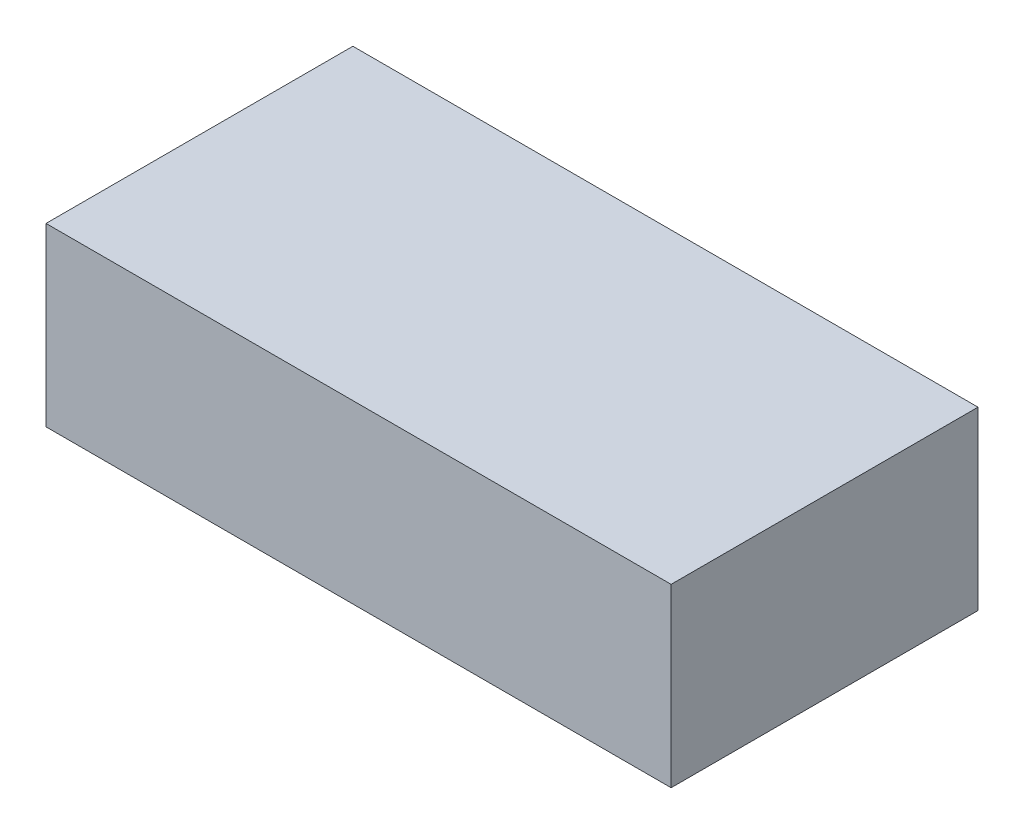
ISO-10303-21;
HEADER;
FILE_DESCRIPTION(('STEP AP214'),'2;1');
FILE_NAME('part.step','',(''),(''),'','','');
FILE_SCHEMA(('AUTOMOTIVE_DESIGN { 1 0 10303 214 1 1 1 1 }'));
ENDSEC;
DATA;
#1=APPLICATION_CONTEXT('core data for automotive mechanical design processes');
#2=APPLICATION_PROTOCOL_DEFINITION('international standard','automotive_design',2000,#1);
#3=PRODUCT_CONTEXT('',#1,'mechanical');
#4=PRODUCT('Part','Part','',(#3));
#5=PRODUCT_RELATED_PRODUCT_CATEGORY('part','',(#4));
#6=PRODUCT_DEFINITION_FORMATION('','',#4);
#7=PRODUCT_DEFINITION_CONTEXT('part definition',#1,'design');
#8=PRODUCT_DEFINITION('design','',#6,#7);
#9=PRODUCT_DEFINITION_SHAPE('','',#8);
#10=(LENGTH_UNIT() NAMED_UNIT(*) SI_UNIT(.MILLI.,.METRE.));
#11=(NAMED_UNIT(*) PLANE_ANGLE_UNIT() SI_UNIT($,.RADIAN.));
#12=(NAMED_UNIT(*) SI_UNIT($,.STERADIAN.) SOLID_ANGLE_UNIT());
#13=UNCERTAINTY_MEASURE_WITH_UNIT(LENGTH_MEASURE(1.E-05),#10,'distance_accuracy_value','');
#14=(GEOMETRIC_REPRESENTATION_CONTEXT(3) GLOBAL_UNCERTAINTY_ASSIGNED_CONTEXT((#13)) GLOBAL_UNIT_ASSIGNED_CONTEXT((#10,
#11,#12)) REPRESENTATION_CONTEXT('',''));
#15=CARTESIAN_POINT('',(0.,0.,0.));
#16=DIRECTION('',(0.,0.,1.));
#17=DIRECTION('',(1.,0.,0.));
#18=AXIS2_PLACEMENT_3D('',#15,#16,#17);
#19=CARTESIAN_POINT('',(-110.,62.,54.));
#20=DIRECTION('',(1.,0.,0.));
#21=DIRECTION('',(0.,0.,-1.));
#22=AXIS2_PLACEMENT_3D('',#19,#20,#21);
#23=PLANE('',#22);
#24=DIRECTION('',(0.,1.,0.));
#25=VECTOR('',#24,1.);
#26=CARTESIAN_POINT('',(-110.,37.,-24.3));
#27=LINE('',#26,#25);
#28=CARTESIAN_POINT('',(-110.,37.,-24.3));
#29=VERTEX_POINT('',#28);
#30=CARTESIAN_POINT('',(-110.,57.,-24.3));
#31=VERTEX_POINT('',#30);
#32=EDGE_CURVE('E143',#29,#31,#27,.T.);
#33=ORIENTED_EDGE('',*,*,#32,.F.);
#34=DIRECTION('',(0.,0.,1.));
#35=VECTOR('',#34,1.);
#36=CARTESIAN_POINT('',(-110.,37.,-49.));
#37=LINE('',#36,#35);
#38=CARTESIAN_POINT('',(-110.,37.,-49.));
#39=VERTEX_POINT('',#38);
#40=EDGE_CURVE('E156',#39,#29,#37,.T.);
#41=ORIENTED_EDGE('',*,*,#40,.F.);
#42=DIRECTION('',(0.,-1.,0.));
#43=VECTOR('',#42,1.);
#44=CARTESIAN_POINT('',(-110.,37.,-49.));
#45=LINE('',#44,#43);
#46=CARTESIAN_POINT('',(-110.,57.,-49.));
#47=VERTEX_POINT('',#46);
#48=EDGE_CURVE('E165',#47,#39,#45,.T.);
#49=ORIENTED_EDGE('',*,*,#48,.F.);
#50=DIRECTION('',(0.,0.,-1.));
#51=VECTOR('',#50,1.);
#52=CARTESIAN_POINT('',(-110.,57.,-49.));
#53=LINE('',#52,#51);
#54=EDGE_CURVE('E146',#31,#47,#53,.T.);
#55=ORIENTED_EDGE('',*,*,#54,.F.);
#56=EDGE_LOOP('',(#33,#41,#49,#55));
#57=FACE_BOUND('',#56,.T.);
#58=DIRECTION('',(0.,0.,1.));
#59=VECTOR('',#58,1.);
#60=CARTESIAN_POINT('',(-110.,0.,54.));
#61=LINE('',#60,#59);
#62=CARTESIAN_POINT('',(-110.,0.,-54.));
#63=VERTEX_POINT('',#62);
#64=CARTESIAN_POINT('',(-110.,0.,54.));
#65=VERTEX_POINT('',#64);
#66=EDGE_CURVE('E197',#63,#65,#61,.T.);
#67=ORIENTED_EDGE('',*,*,#66,.T.);
#68=DIRECTION('',(0.,-1.,0.));
#69=VECTOR('',#68,1.);
#70=CARTESIAN_POINT('',(-110.,62.,54.));
#71=LINE('',#70,#69);
#72=CARTESIAN_POINT('',(-110.,62.,54.));
#73=VERTEX_POINT('',#72);
#74=EDGE_CURVE('E202',#73,#65,#71,.T.);
#75=ORIENTED_EDGE('',*,*,#74,.F.);
#76=DIRECTION('',(0.,0.,1.));
#77=VECTOR('',#76,1.);
#78=CARTESIAN_POINT('',(-110.,62.,54.));
#79=LINE('',#78,#77);
#80=CARTESIAN_POINT('',(-110.,62.,-54.));
#81=VERTEX_POINT('',#80);
#82=EDGE_CURVE('E188',#81,#73,#79,.T.);
#83=ORIENTED_EDGE('',*,*,#82,.F.);
#84=DIRECTION('',(0.,-1.,0.));
#85=VECTOR('',#84,1.);
#86=CARTESIAN_POINT('',(-110.,62.,-54.));
#87=LINE('',#86,#85);
#88=EDGE_CURVE('E41',#81,#63,#87,.T.);
#89=ORIENTED_EDGE('',*,*,#88,.T.);
#90=EDGE_LOOP('',(#67,#75,#83,#89));
#91=FACE_BOUND('',#90,.T.);
#92=DIRECTION('',(0.,1.,0.));
#93=VECTOR('',#92,1.);
#94=CARTESIAN_POINT('',(-110.,6.,47.));
#95=LINE('',#94,#93);
#96=CARTESIAN_POINT('',(-110.,6.,47.));
#97=VERTEX_POINT('',#96);
#98=CARTESIAN_POINT('',(-110.,56.,47.));
#99=VERTEX_POINT('',#98);
#100=EDGE_CURVE('E142',#97,#99,#95,.T.);
#101=ORIENTED_EDGE('',*,*,#100,.F.);
#102=DIRECTION('',(0.,0.,1.));
#103=VECTOR('',#102,1.);
#104=CARTESIAN_POINT('',(-110.,6.,-3.00000000000002));
#105=LINE('',#104,#103);
#106=CARTESIAN_POINT('',(-110.,6.,-3.00000000000002));
#107=VERTEX_POINT('',#106);
#108=EDGE_CURVE('E139',#107,#97,#105,.T.);
#109=ORIENTED_EDGE('',*,*,#108,.F.);
#110=DIRECTION('',(0.,-1.,0.));
#111=VECTOR('',#110,1.);
#112=CARTESIAN_POINT('',(-110.,6.,-3.00000000000002));
#113=LINE('',#112,#111);
#114=CARTESIAN_POINT('',(-110.,56.,-3.00000000000002));
#115=VERTEX_POINT('',#114);
#116=EDGE_CURVE('E53',#115,#107,#113,.T.);
#117=ORIENTED_EDGE('',*,*,#116,.F.);
#118=DIRECTION('',(0.,0.,-1.));
#119=VECTOR('',#118,1.);
#120=CARTESIAN_POINT('',(-110.,56.,-3.00000000000002));
#121=LINE('',#120,#119);
#122=EDGE_CURVE('E48',#99,#115,#121,.T.);
#123=ORIENTED_EDGE('',*,*,#122,.F.);
#124=EDGE_LOOP('',(#101,#109,#117,#123));
#125=FACE_BOUND('',#124,.T.);
#126=ADVANCED_FACE('F33',(#57,#91,#125),#23,.F.);
#127=CARTESIAN_POINT('',(110.,62.,54.));
#128=DIRECTION('',(-1.,0.,0.));
#129=DIRECTION('',(0.,0.,1.));
#130=AXIS2_PLACEMENT_3D('',#127,#128,#129);
#131=PLANE('',#130);
#132=DIRECTION('',(0.,0.,-1.));
#133=VECTOR('',#132,1.);
#134=CARTESIAN_POINT('',(110.,0.,54.));
#135=LINE('',#134,#133);
#136=CARTESIAN_POINT('',(110.,0.,54.));
#137=VERTEX_POINT('',#136);
#138=CARTESIAN_POINT('',(110.,0.,-54.));
#139=VERTEX_POINT('',#138);
#140=EDGE_CURVE('E181',#137,#139,#135,.T.);
#141=ORIENTED_EDGE('',*,*,#140,.T.);
#142=DIRECTION('',(0.,-1.,0.));
#143=VECTOR('',#142,1.);
#144=CARTESIAN_POINT('',(110.,62.,-54.));
#145=LINE('',#144,#143);
#146=CARTESIAN_POINT('',(110.,62.,-54.));
#147=VERTEX_POINT('',#146);
#148=EDGE_CURVE('E11',#147,#139,#145,.T.);
#149=ORIENTED_EDGE('',*,*,#148,.F.);
#150=DIRECTION('',(0.,0.,-1.));
#151=VECTOR('',#150,1.);
#152=CARTESIAN_POINT('',(110.,62.,54.));
#153=LINE('',#152,#151);
#154=CARTESIAN_POINT('',(110.,62.,54.));
#155=VERTEX_POINT('',#154);
#156=EDGE_CURVE('E182',#155,#147,#153,.T.);
#157=ORIENTED_EDGE('',*,*,#156,.F.);
#158=DIRECTION('',(0.,-1.,0.));
#159=VECTOR('',#158,1.);
#160=CARTESIAN_POINT('',(110.,62.,54.));
#161=LINE('',#160,#159);
#162=EDGE_CURVE('E192',#155,#137,#161,.T.);
#163=ORIENTED_EDGE('',*,*,#162,.T.);
#164=EDGE_LOOP('',(#141,#149,#157,#163));
#165=FACE_BOUND('',#164,.T.);
#166=ADVANCED_FACE('F35',(#165),#131,.F.);
#167=CARTESIAN_POINT('',(-110.,62.,-54.));
#168=DIRECTION('',(0.,0.,1.));
#169=DIRECTION('',(1.,0.,0.));
#170=AXIS2_PLACEMENT_3D('',#167,#168,#169);
#171=PLANE('',#170);
#172=DIRECTION('',(-1.,0.,0.));
#173=VECTOR('',#172,1.);
#174=CARTESIAN_POINT('',(-110.,0.,-54.));
#175=LINE('',#174,#173);
#176=EDGE_CURVE('E195',#139,#63,#175,.T.);
#177=ORIENTED_EDGE('',*,*,#176,.T.);
#178=ORIENTED_EDGE('',*,*,#88,.F.);
#179=DIRECTION('',(-1.,0.,0.));
#180=VECTOR('',#179,1.);
#181=CARTESIAN_POINT('',(-110.,62.,-54.));
#182=LINE('',#181,#180);
#183=EDGE_CURVE('E185',#147,#81,#182,.T.);
#184=ORIENTED_EDGE('',*,*,#183,.F.);
#185=ORIENTED_EDGE('',*,*,#148,.T.);
#186=EDGE_LOOP('',(#177,#178,#184,#185));
#187=FACE_BOUND('',#186,.T.);
#188=ADVANCED_FACE('F224',(#187),#171,.F.);
#189=CARTESIAN_POINT('',(-110.,62.,54.));
#190=DIRECTION('',(0.,0.,-1.));
#191=DIRECTION('',(-1.,0.,0.));
#192=AXIS2_PLACEMENT_3D('',#189,#190,#191);
#193=PLANE('',#192);
#194=DIRECTION('',(1.,0.,0.));
#195=VECTOR('',#194,1.);
#196=CARTESIAN_POINT('',(-110.,0.,54.));
#197=LINE('',#196,#195);
#198=EDGE_CURVE('E186',#65,#137,#197,.T.);
#199=ORIENTED_EDGE('',*,*,#198,.T.);
#200=ORIENTED_EDGE('',*,*,#162,.F.);
#201=DIRECTION('',(1.,0.,0.));
#202=VECTOR('',#201,1.);
#203=CARTESIAN_POINT('',(-110.,62.,54.));
#204=LINE('',#203,#202);
#205=EDGE_CURVE('E190',#73,#155,#204,.T.);
#206=ORIENTED_EDGE('',*,*,#205,.F.);
#207=ORIENTED_EDGE('',*,*,#74,.T.);
#208=EDGE_LOOP('',(#199,#200,#206,#207));
#209=FACE_BOUND('',#208,.T.);
#210=ADVANCED_FACE('F217',(#209),#193,.F.);
#211=CARTESIAN_POINT('',(0.,62.,0.));
#212=DIRECTION('',(0.,-1.,0.));
#213=DIRECTION('',(0.,0.,-1.));
#214=AXIS2_PLACEMENT_3D('',#211,#212,#213);
#215=PLANE('',#214);
#216=ORIENTED_EDGE('',*,*,#156,.T.);
#217=ORIENTED_EDGE('',*,*,#183,.T.);
#218=ORIENTED_EDGE('',*,*,#82,.T.);
#219=ORIENTED_EDGE('',*,*,#205,.T.);
#220=EDGE_LOOP('',(#216,#217,#218,#219));
#221=FACE_BOUND('',#220,.T.);
#222=ADVANCED_FACE('F223',(#221),#215,.F.);
#223=CARTESIAN_POINT('',(0.,0.,0.));
#224=DIRECTION('',(0.,-1.,0.));
#225=DIRECTION('',(0.,0.,-1.));
#226=AXIS2_PLACEMENT_3D('',#223,#224,#225);
#227=PLANE('',#226);
#228=ORIENTED_EDGE('',*,*,#140,.F.);
#229=ORIENTED_EDGE('',*,*,#198,.F.);
#230=ORIENTED_EDGE('',*,*,#66,.F.);
#231=ORIENTED_EDGE('',*,*,#176,.F.);
#232=EDGE_LOOP('',(#228,#229,#230,#231));
#233=FACE_BOUND('',#232,.T.);
#234=ADVANCED_FACE('F214',(#233),#227,.T.);
#235=CARTESIAN_POINT('',(-110.5,37.,-24.3));
#236=DIRECTION('',(0.,0.,-1.));
#237=DIRECTION('',(-1.,0.,0.));
#238=AXIS2_PLACEMENT_3D('',#235,#236,#237);
#239=PLANE('',#238);
#240=ORIENTED_EDGE('',*,*,#32,.T.);
#241=DIRECTION('',(1.,0.,0.));
#242=VECTOR('',#241,1.);
#243=CARTESIAN_POINT('',(-110.5,57.,-24.3));
#244=LINE('',#243,#242);
#245=CARTESIAN_POINT('',(-110.5,57.,-24.3));
#246=VERTEX_POINT('',#245);
#247=EDGE_CURVE('E178',#246,#31,#244,.T.);
#248=ORIENTED_EDGE('',*,*,#247,.F.);
#249=DIRECTION('',(0.,1.,0.));
#250=VECTOR('',#249,1.);
#251=CARTESIAN_POINT('',(-110.5,37.,-24.3));
#252=LINE('',#251,#250);
#253=CARTESIAN_POINT('',(-110.5,37.,-24.3));
#254=VERTEX_POINT('',#253);
#255=EDGE_CURVE('E152',#254,#246,#252,.T.);
#256=ORIENTED_EDGE('',*,*,#255,.F.);
#257=DIRECTION('',(1.,0.,0.));
#258=VECTOR('',#257,1.);
#259=CARTESIAN_POINT('',(-110.5,37.,-24.3));
#260=LINE('',#259,#258);
#261=EDGE_CURVE('E161',#254,#29,#260,.T.);
#262=ORIENTED_EDGE('',*,*,#261,.T.);
#263=EDGE_LOOP('',(#240,#248,#256,#262));
#264=FACE_BOUND('',#263,.T.);
#265=ADVANCED_FACE('F239',(#264),#239,.F.);
#266=CARTESIAN_POINT('',(-110.5,57.,-49.));
#267=DIRECTION('',(0.,-1.,0.));
#268=DIRECTION('',(0.,0.,-1.));
#269=AXIS2_PLACEMENT_3D('',#266,#267,#268);
#270=PLANE('',#269);
#271=ORIENTED_EDGE('',*,*,#54,.T.);
#272=DIRECTION('',(1.,0.,0.));
#273=VECTOR('',#272,1.);
#274=CARTESIAN_POINT('',(-110.5,57.,-49.));
#275=LINE('',#274,#273);
#276=CARTESIAN_POINT('',(-110.5,57.,-49.));
#277=VERTEX_POINT('',#276);
#278=EDGE_CURVE('E175',#277,#47,#275,.T.);
#279=ORIENTED_EDGE('',*,*,#278,.F.);
#280=DIRECTION('',(0.,0.,-1.));
#281=VECTOR('',#280,1.);
#282=CARTESIAN_POINT('',(-110.5,57.,-49.));
#283=LINE('',#282,#281);
#284=EDGE_CURVE('E155',#246,#277,#283,.T.);
#285=ORIENTED_EDGE('',*,*,#284,.F.);
#286=ORIENTED_EDGE('',*,*,#247,.T.);
#287=EDGE_LOOP('',(#271,#279,#285,#286));
#288=FACE_BOUND('',#287,.T.);
#289=ADVANCED_FACE('F244',(#288),#270,.F.);
#290=CARTESIAN_POINT('',(-110.5,37.,-49.));
#291=DIRECTION('',(0.,0.,1.));
#292=DIRECTION('',(1.,0.,0.));
#293=AXIS2_PLACEMENT_3D('',#290,#291,#292);
#294=PLANE('',#293);
#295=ORIENTED_EDGE('',*,*,#48,.T.);
#296=DIRECTION('',(1.,0.,0.));
#297=VECTOR('',#296,1.);
#298=CARTESIAN_POINT('',(-110.5,37.,-49.));
#299=LINE('',#298,#297);
#300=CARTESIAN_POINT('',(-110.5,37.,-49.));
#301=VERTEX_POINT('',#300);
#302=EDGE_CURVE('E172',#301,#39,#299,.T.);
#303=ORIENTED_EDGE('',*,*,#302,.F.);
#304=DIRECTION('',(0.,-1.,0.));
#305=VECTOR('',#304,1.);
#306=CARTESIAN_POINT('',(-110.5,37.,-49.));
#307=LINE('',#306,#305);
#308=EDGE_CURVE('E158',#277,#301,#307,.T.);
#309=ORIENTED_EDGE('',*,*,#308,.F.);
#310=ORIENTED_EDGE('',*,*,#278,.T.);
#311=EDGE_LOOP('',(#295,#303,#309,#310));
#312=FACE_BOUND('',#311,.T.);
#313=ADVANCED_FACE('F248',(#312),#294,.F.);
#314=CARTESIAN_POINT('',(-110.5,37.,-49.));
#315=DIRECTION('',(0.,1.,0.));
#316=DIRECTION('',(0.,0.,1.));
#317=AXIS2_PLACEMENT_3D('',#314,#315,#316);
#318=PLANE('',#317);
#319=ORIENTED_EDGE('',*,*,#40,.T.);
#320=ORIENTED_EDGE('',*,*,#261,.F.);
#321=DIRECTION('',(0.,0.,1.));
#322=VECTOR('',#321,1.);
#323=CARTESIAN_POINT('',(-110.5,37.,-49.));
#324=LINE('',#323,#322);
#325=EDGE_CURVE('E160',#301,#254,#324,.T.);
#326=ORIENTED_EDGE('',*,*,#325,.F.);
#327=ORIENTED_EDGE('',*,*,#302,.T.);
#328=EDGE_LOOP('',(#319,#320,#326,#327));
#329=FACE_BOUND('',#328,.T.);
#330=ADVANCED_FACE('F252',(#329),#318,.F.);
#331=CARTESIAN_POINT('',(-110.5,0.,0.));
#332=DIRECTION('',(1.,0.,0.));
#333=DIRECTION('',(0.,0.,-1.));
#334=AXIS2_PLACEMENT_3D('',#331,#332,#333);
#335=PLANE('',#334);
#336=ORIENTED_EDGE('',*,*,#255,.T.);
#337=ORIENTED_EDGE('',*,*,#284,.T.);
#338=ORIENTED_EDGE('',*,*,#308,.T.);
#339=ORIENTED_EDGE('',*,*,#325,.T.);
#340=EDGE_LOOP('',(#336,#337,#338,#339));
#341=FACE_BOUND('',#340,.T.);
#342=ADVANCED_FACE('F256',(#341),#335,.F.);
#343=CARTESIAN_POINT('',(-110.5,6.,47.));
#344=DIRECTION('',(0.,0.,-1.));
#345=DIRECTION('',(-1.,0.,0.));
#346=AXIS2_PLACEMENT_3D('',#343,#344,#345);
#347=PLANE('',#346);
#348=ORIENTED_EDGE('',*,*,#100,.T.);
#349=DIRECTION('',(1.,0.,0.));
#350=VECTOR('',#349,1.);
#351=CARTESIAN_POINT('',(-110.5,56.,47.));
#352=LINE('',#351,#350);
#353=CARTESIAN_POINT('',(-110.5,56.,47.));
#354=VERTEX_POINT('',#353);
#355=EDGE_CURVE('E123',#354,#99,#352,.T.);
#356=ORIENTED_EDGE('',*,*,#355,.F.);
#357=DIRECTION('',(0.,1.,0.));
#358=VECTOR('',#357,1.);
#359=CARTESIAN_POINT('',(-110.5,6.,47.));
#360=LINE('',#359,#358);
#361=CARTESIAN_POINT('',(-110.5,6.,47.));
#362=VERTEX_POINT('',#361);
#363=EDGE_CURVE('E130',#362,#354,#360,.T.);
#364=ORIENTED_EDGE('',*,*,#363,.F.);
#365=DIRECTION('',(1.,0.,0.));
#366=VECTOR('',#365,1.);
#367=CARTESIAN_POINT('',(-110.5,6.,47.));
#368=LINE('',#367,#366);
#369=EDGE_CURVE('E368',#362,#97,#368,.T.);
#370=ORIENTED_EDGE('',*,*,#369,.T.);
#371=EDGE_LOOP('',(#348,#356,#364,#370));
#372=FACE_BOUND('',#371,.T.);
#373=ADVANCED_FACE('F141',(#372),#347,.F.);
#374=CARTESIAN_POINT('',(-110.5,56.,-3.00000000000002));
#375=DIRECTION('',(0.,-1.,0.));
#376=DIRECTION('',(0.,0.,-1.));
#377=AXIS2_PLACEMENT_3D('',#374,#375,#376);
#378=PLANE('',#377);
#379=ORIENTED_EDGE('',*,*,#122,.T.);
#380=DIRECTION('',(1.,0.,0.));
#381=VECTOR('',#380,1.);
#382=CARTESIAN_POINT('',(-110.5,56.,-3.00000000000002));
#383=LINE('',#382,#381);
#384=CARTESIAN_POINT('',(-110.5,56.,-3.00000000000002));
#385=VERTEX_POINT('',#384);
#386=EDGE_CURVE('E126',#385,#115,#383,.T.);
#387=ORIENTED_EDGE('',*,*,#386,.F.);
#388=DIRECTION('',(0.,0.,-1.));
#389=VECTOR('',#388,1.);
#390=CARTESIAN_POINT('',(-110.5,56.,-3.00000000000002));
#391=LINE('',#390,#389);
#392=EDGE_CURVE('E119',#354,#385,#391,.T.);
#393=ORIENTED_EDGE('',*,*,#392,.F.);
#394=ORIENTED_EDGE('',*,*,#355,.T.);
#395=EDGE_LOOP('',(#379,#387,#393,#394));
#396=FACE_BOUND('',#395,.T.);
#397=ADVANCED_FACE('F121',(#396),#378,.F.);
#398=CARTESIAN_POINT('',(-110.5,6.,-3.00000000000002));
#399=DIRECTION('',(0.,0.,1.));
#400=DIRECTION('',(1.,0.,0.));
#401=AXIS2_PLACEMENT_3D('',#398,#399,#400);
#402=PLANE('',#401);
#403=ORIENTED_EDGE('',*,*,#116,.T.);
#404=DIRECTION('',(1.,0.,0.));
#405=VECTOR('',#404,1.);
#406=CARTESIAN_POINT('',(-110.5,6.,-3.00000000000002));
#407=LINE('',#406,#405);
#408=CARTESIAN_POINT('',(-110.5,6.,-3.00000000000002));
#409=VERTEX_POINT('',#408);
#410=EDGE_CURVE('E148',#409,#107,#407,.T.);
#411=ORIENTED_EDGE('',*,*,#410,.F.);
#412=DIRECTION('',(0.,-1.,0.));
#413=VECTOR('',#412,1.);
#414=CARTESIAN_POINT('',(-110.5,6.,-3.00000000000002));
#415=LINE('',#414,#413);
#416=EDGE_CURVE('E129',#385,#409,#415,.T.);
#417=ORIENTED_EDGE('',*,*,#416,.F.);
#418=ORIENTED_EDGE('',*,*,#386,.T.);
#419=EDGE_LOOP('',(#403,#411,#417,#418));
#420=FACE_BOUND('',#419,.T.);
#421=ADVANCED_FACE('F265',(#420),#402,.F.);
#422=CARTESIAN_POINT('',(-110.5,6.,-3.00000000000002));
#423=DIRECTION('',(0.,1.,0.));
#424=DIRECTION('',(0.,0.,1.));
#425=AXIS2_PLACEMENT_3D('',#422,#423,#424);
#426=PLANE('',#425);
#427=ORIENTED_EDGE('',*,*,#108,.T.);
#428=ORIENTED_EDGE('',*,*,#369,.F.);
#429=DIRECTION('',(0.,0.,1.));
#430=VECTOR('',#429,1.);
#431=CARTESIAN_POINT('',(-110.5,6.,-3.00000000000002));
#432=LINE('',#431,#430);
#433=EDGE_CURVE('E135',#409,#362,#432,.T.);
#434=ORIENTED_EDGE('',*,*,#433,.F.);
#435=ORIENTED_EDGE('',*,*,#410,.T.);
#436=EDGE_LOOP('',(#427,#428,#434,#435));
#437=FACE_BOUND('',#436,.T.);
#438=ADVANCED_FACE('F268',(#437),#426,.F.);
#439=CARTESIAN_POINT('',(-110.5,0.,0.));
#440=DIRECTION('',(1.,0.,0.));
#441=DIRECTION('',(0.,0.,-1.));
#442=AXIS2_PLACEMENT_3D('',#439,#440,#441);
#443=PLANE('',#442);
#444=ORIENTED_EDGE('',*,*,#363,.T.);
#445=ORIENTED_EDGE('',*,*,#392,.T.);
#446=ORIENTED_EDGE('',*,*,#416,.T.);
#447=ORIENTED_EDGE('',*,*,#433,.T.);
#448=EDGE_LOOP('',(#444,#445,#446,#447));
#449=FACE_BOUND('',#448,.T.);
#450=ADVANCED_FACE('F133',(#449),#443,.F.);
#451=CLOSED_SHELL('',(#126,#166,#188,#210,#222,#234,#265,#289,#313,#330,#342,#373,#397,#421,
#438,#450));
#452=MANIFOLD_SOLID_BREP('B2',#451);
#453=ADVANCED_BREP_SHAPE_REPRESENTATION('',(#18,#452),#14);
#454=SHAPE_DEFINITION_REPRESENTATION(#9,#453);
ENDSEC;
END-ISO-10303-21;
